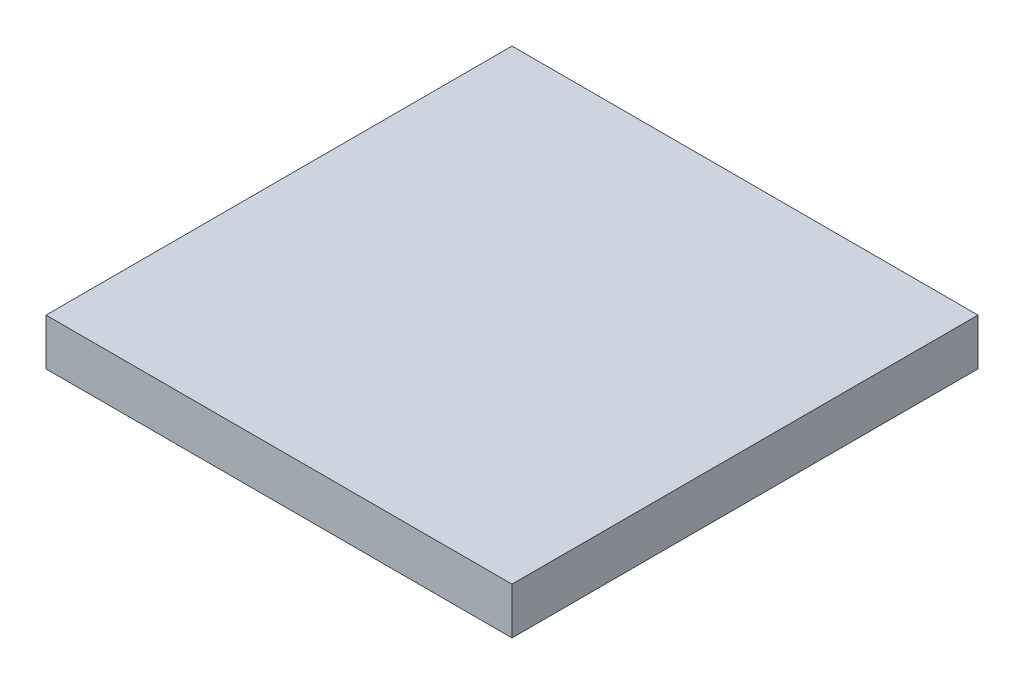
ISO-10303-21;
HEADER;
FILE_DESCRIPTION(('STEP AP214'),'2;1');
FILE_NAME('part.step','',(''),(''),'','','');
FILE_SCHEMA(('AUTOMOTIVE_DESIGN { 1 0 10303 214 1 1 1 1 }'));
ENDSEC;
DATA;
#1=APPLICATION_CONTEXT('core data for automotive mechanical design processes');
#2=APPLICATION_PROTOCOL_DEFINITION('international standard','automotive_design',2000,#1);
#3=PRODUCT_CONTEXT('',#1,'mechanical');
#4=PRODUCT('Part','Part','',(#3));
#5=PRODUCT_RELATED_PRODUCT_CATEGORY('part','',(#4));
#6=PRODUCT_DEFINITION_FORMATION('','',#4);
#7=PRODUCT_DEFINITION_CONTEXT('part definition',#1,'design');
#8=PRODUCT_DEFINITION('design','',#6,#7);
#9=PRODUCT_DEFINITION_SHAPE('','',#8);
#10=(LENGTH_UNIT() NAMED_UNIT(*) SI_UNIT(.MILLI.,.METRE.));
#11=(NAMED_UNIT(*) PLANE_ANGLE_UNIT() SI_UNIT($,.RADIAN.));
#12=(NAMED_UNIT(*) SI_UNIT($,.STERADIAN.) SOLID_ANGLE_UNIT());
#13=UNCERTAINTY_MEASURE_WITH_UNIT(LENGTH_MEASURE(1.E-05),#10,'distance_accuracy_value','');
#14=(GEOMETRIC_REPRESENTATION_CONTEXT(3) GLOBAL_UNCERTAINTY_ASSIGNED_CONTEXT((#13)) GLOBAL_UNIT_ASSIGNED_CONTEXT((#10,
#11,#12)) REPRESENTATION_CONTEXT('',''));
#15=CARTESIAN_POINT('',(0.,0.,0.));
#16=DIRECTION('',(0.,0.,1.));
#17=DIRECTION('',(1.,0.,0.));
#18=AXIS2_PLACEMENT_3D('',#15,#16,#17);
#19=CARTESIAN_POINT('',(0.,100.,0.));
#20=DIRECTION('',(1.,0.,0.));
#21=DIRECTION('',(0.,0.,-1.));
#22=AXIS2_PLACEMENT_3D('',#19,#20,#21);
#23=PLANE('',#22);
#24=DIRECTION('',(0.,0.,1.));
#25=VECTOR('',#24,1.);
#26=CARTESIAN_POINT('',(0.,0.,0.));
#27=LINE('',#26,#25);
#28=CARTESIAN_POINT('',(0.,0.,-1000.));
#29=VERTEX_POINT('',#28);
#30=CARTESIAN_POINT('',(0.,0.,0.));
#31=VERTEX_POINT('',#30);
#32=EDGE_CURVE('E102',#29,#31,#27,.T.);
#33=ORIENTED_EDGE('',*,*,#32,.T.);
#34=DIRECTION('',(0.,-1.,0.));
#35=VECTOR('',#34,1.);
#36=CARTESIAN_POINT('',(0.,100.,0.));
#37=LINE('',#36,#35);
#38=CARTESIAN_POINT('',(0.,100.,0.));
#39=VERTEX_POINT('',#38);
#40=EDGE_CURVE('E11',#39,#31,#37,.T.);
#41=ORIENTED_EDGE('',*,*,#40,.F.);
#42=DIRECTION('',(0.,0.,1.));
#43=VECTOR('',#42,1.);
#44=CARTESIAN_POINT('',(0.,100.,0.));
#45=LINE('',#44,#43);
#46=CARTESIAN_POINT('',(0.,100.,-1000.));
#47=VERTEX_POINT('',#46);
#48=EDGE_CURVE('E90',#47,#39,#45,.T.);
#49=ORIENTED_EDGE('',*,*,#48,.F.);
#50=DIRECTION('',(0.,-1.,0.));
#51=VECTOR('',#50,1.);
#52=CARTESIAN_POINT('',(0.,100.,-1000.));
#53=LINE('',#52,#51);
#54=EDGE_CURVE('E98',#47,#29,#53,.T.);
#55=ORIENTED_EDGE('',*,*,#54,.T.);
#56=EDGE_LOOP('',(#33,#41,#49,#55));
#57=FACE_BOUND('',#56,.T.);
#58=ADVANCED_FACE('F39',(#57),#23,.F.);
#59=CARTESIAN_POINT('',(0.,100.,0.));
#60=DIRECTION('',(0.,0.,-1.));
#61=DIRECTION('',(-1.,0.,0.));
#62=AXIS2_PLACEMENT_3D('',#59,#60,#61);
#63=PLANE('',#62);
#64=DIRECTION('',(1.,0.,0.));
#65=VECTOR('',#64,1.);
#66=CARTESIAN_POINT('',(0.,0.,0.));
#67=LINE('',#66,#65);
#68=CARTESIAN_POINT('',(1000.,0.,0.));
#69=VERTEX_POINT('',#68);
#70=EDGE_CURVE('E94',#31,#69,#67,.T.);
#71=ORIENTED_EDGE('',*,*,#70,.T.);
#72=DIRECTION('',(0.,-1.,0.));
#73=VECTOR('',#72,1.);
#74=CARTESIAN_POINT('',(1000.,100.,0.));
#75=LINE('',#74,#73);
#76=CARTESIAN_POINT('',(1000.,100.,0.));
#77=VERTEX_POINT('',#76);
#78=EDGE_CURVE('E47',#77,#69,#75,.T.);
#79=ORIENTED_EDGE('',*,*,#78,.F.);
#80=DIRECTION('',(1.,0.,0.));
#81=VECTOR('',#80,1.);
#82=CARTESIAN_POINT('',(0.,100.,0.));
#83=LINE('',#82,#81);
#84=EDGE_CURVE('E85',#39,#77,#83,.T.);
#85=ORIENTED_EDGE('',*,*,#84,.F.);
#86=ORIENTED_EDGE('',*,*,#40,.T.);
#87=EDGE_LOOP('',(#71,#79,#85,#86));
#88=FACE_BOUND('',#87,.T.);
#89=ADVANCED_FACE('F93',(#88),#63,.F.);
#90=CARTESIAN_POINT('',(1000.,100.,0.));
#91=DIRECTION('',(-1.,0.,0.));
#92=DIRECTION('',(0.,0.,1.));
#93=AXIS2_PLACEMENT_3D('',#90,#91,#92);
#94=PLANE('',#93);
#95=DIRECTION('',(0.,0.,-1.));
#96=VECTOR('',#95,1.);
#97=CARTESIAN_POINT('',(1000.,0.,0.));
#98=LINE('',#97,#96);
#99=CARTESIAN_POINT('',(1000.,0.,-1000.));
#100=VERTEX_POINT('',#99);
#101=EDGE_CURVE('E72',#69,#100,#98,.T.);
#102=ORIENTED_EDGE('',*,*,#101,.T.);
#103=DIRECTION('',(0.,-1.,0.));
#104=VECTOR('',#103,1.);
#105=CARTESIAN_POINT('',(1000.,100.,-1000.));
#106=LINE('',#105,#104);
#107=CARTESIAN_POINT('',(1000.,100.,-1000.));
#108=VERTEX_POINT('',#107);
#109=EDGE_CURVE('E95',#108,#100,#106,.T.);
#110=ORIENTED_EDGE('',*,*,#109,.F.);
#111=DIRECTION('',(0.,0.,-1.));
#112=VECTOR('',#111,1.);
#113=CARTESIAN_POINT('',(1000.,100.,0.));
#114=LINE('',#113,#112);
#115=EDGE_CURVE('E88',#77,#108,#114,.T.);
#116=ORIENTED_EDGE('',*,*,#115,.F.);
#117=ORIENTED_EDGE('',*,*,#78,.T.);
#118=EDGE_LOOP('',(#102,#110,#116,#117));
#119=FACE_BOUND('',#118,.T.);
#120=ADVANCED_FACE('F96',(#119),#94,.F.);
#121=CARTESIAN_POINT('',(0.,100.,-1000.));
#122=DIRECTION('',(0.,0.,1.));
#123=DIRECTION('',(1.,0.,0.));
#124=AXIS2_PLACEMENT_3D('',#121,#122,#123);
#125=PLANE('',#124);
#126=DIRECTION('',(-1.,0.,0.));
#127=VECTOR('',#126,1.);
#128=CARTESIAN_POINT('',(0.,0.,-1000.));
#129=LINE('',#128,#127);
#130=EDGE_CURVE('E78',#100,#29,#129,.T.);
#131=ORIENTED_EDGE('',*,*,#130,.T.);
#132=ORIENTED_EDGE('',*,*,#54,.F.);
#133=DIRECTION('',(-1.,0.,0.));
#134=VECTOR('',#133,1.);
#135=CARTESIAN_POINT('',(0.,100.,-1000.));
#136=LINE('',#135,#134);
#137=EDGE_CURVE('E55',#108,#47,#136,.T.);
#138=ORIENTED_EDGE('',*,*,#137,.F.);
#139=ORIENTED_EDGE('',*,*,#109,.T.);
#140=EDGE_LOOP('',(#131,#132,#138,#139));
#141=FACE_BOUND('',#140,.T.);
#142=ADVANCED_FACE('F109',(#141),#125,.F.);
#143=CARTESIAN_POINT('',(0.,100.,0.));
#144=DIRECTION('',(0.,-1.,0.));
#145=DIRECTION('',(0.,0.,-1.));
#146=AXIS2_PLACEMENT_3D('',#143,#144,#145);
#147=PLANE('',#146);
#148=ORIENTED_EDGE('',*,*,#48,.T.);
#149=ORIENTED_EDGE('',*,*,#84,.T.);
#150=ORIENTED_EDGE('',*,*,#115,.T.);
#151=ORIENTED_EDGE('',*,*,#137,.T.);
#152=EDGE_LOOP('',(#148,#149,#150,#151));
#153=FACE_BOUND('',#152,.T.);
#154=ADVANCED_FACE('F86',(#153),#147,.F.);
#155=CARTESIAN_POINT('',(0.,0.,0.));
#156=DIRECTION('',(0.,-1.,0.));
#157=DIRECTION('',(0.,0.,-1.));
#158=AXIS2_PLACEMENT_3D('',#155,#156,#157);
#159=PLANE('',#158);
#160=ORIENTED_EDGE('',*,*,#32,.F.);
#161=ORIENTED_EDGE('',*,*,#130,.F.);
#162=ORIENTED_EDGE('',*,*,#101,.F.);
#163=ORIENTED_EDGE('',*,*,#70,.F.);
#164=EDGE_LOOP('',(#160,#161,#162,#163));
#165=FACE_BOUND('',#164,.T.);
#166=ADVANCED_FACE('F112',(#165),#159,.T.);
#167=CLOSED_SHELL('',(#58,#89,#120,#142,#154,#166));
#168=MANIFOLD_SOLID_BREP('B2',#167);
#169=ADVANCED_BREP_SHAPE_REPRESENTATION('',(#18,#168),#14);
#170=SHAPE_DEFINITION_REPRESENTATION(#9,#169);
ENDSEC;
END-ISO-10303-21;
